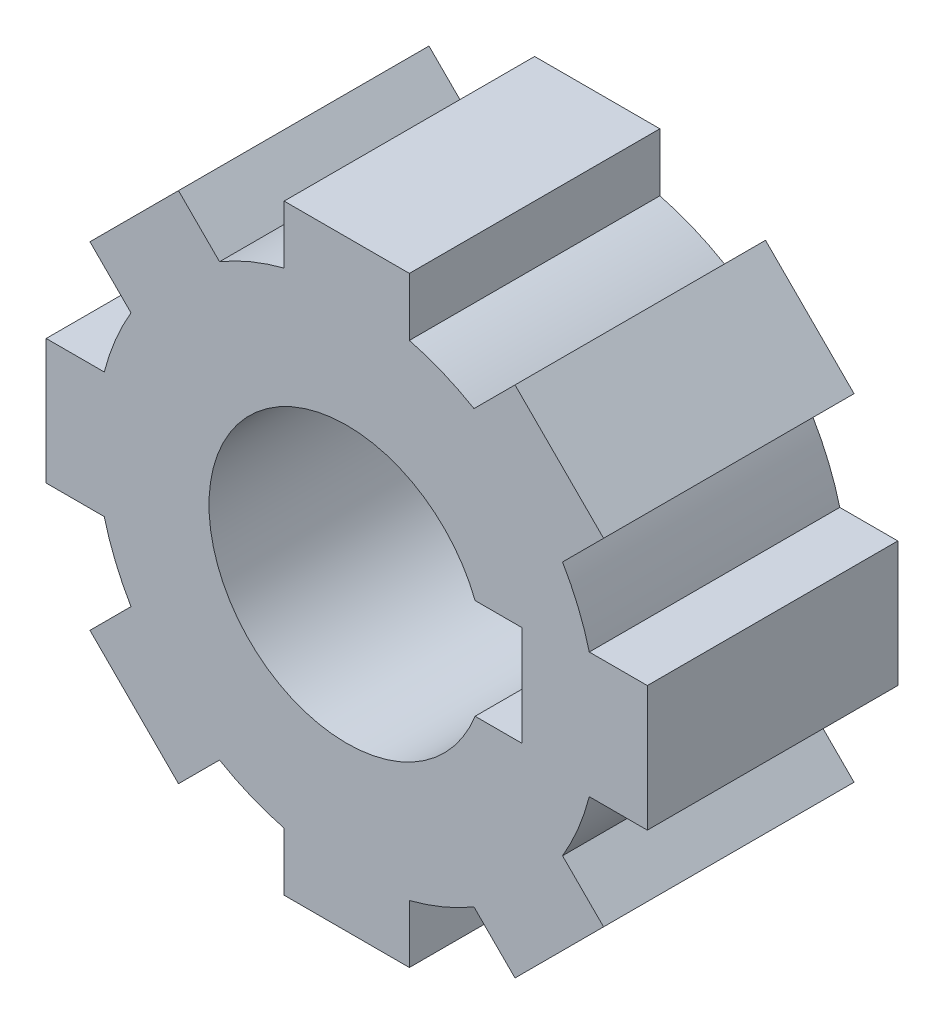
ISO-10303-21;
HEADER;
FILE_DESCRIPTION(('STEP AP214'),'2;1');
FILE_NAME('part.step','',(''),(''),'','','');
FILE_SCHEMA(('AUTOMOTIVE_DESIGN { 1 0 10303 214 1 1 1 1 }'));
ENDSEC;
DATA;
#1=APPLICATION_CONTEXT('core data for automotive mechanical design processes');
#2=APPLICATION_PROTOCOL_DEFINITION('international standard','automotive_design',2000,#1);
#3=PRODUCT_CONTEXT('',#1,'mechanical');
#4=PRODUCT('Part','Part','',(#3));
#5=PRODUCT_RELATED_PRODUCT_CATEGORY('part','',(#4));
#6=PRODUCT_DEFINITION_FORMATION('','',#4);
#7=PRODUCT_DEFINITION_CONTEXT('part definition',#1,'design');
#8=PRODUCT_DEFINITION('design','',#6,#7);
#9=PRODUCT_DEFINITION_SHAPE('','',#8);
#10=(LENGTH_UNIT() NAMED_UNIT(*) SI_UNIT(.MILLI.,.METRE.));
#11=(NAMED_UNIT(*) PLANE_ANGLE_UNIT() SI_UNIT($,.RADIAN.));
#12=(NAMED_UNIT(*) SI_UNIT($,.STERADIAN.) SOLID_ANGLE_UNIT());
#13=UNCERTAINTY_MEASURE_WITH_UNIT(LENGTH_MEASURE(1.E-05),#10,'distance_accuracy_value','');
#14=(GEOMETRIC_REPRESENTATION_CONTEXT(3) GLOBAL_UNCERTAINTY_ASSIGNED_CONTEXT((#13)) GLOBAL_UNIT_ASSIGNED_CONTEXT((#10,
#11,#12)) REPRESENTATION_CONTEXT('',''));
#15=CARTESIAN_POINT('',(0.,0.,0.));
#16=DIRECTION('',(0.,0.,1.));
#17=DIRECTION('',(1.,0.,0.));
#18=AXIS2_PLACEMENT_3D('',#15,#16,#17);
#19=CARTESIAN_POINT('',(0.,0.,5.));
#20=DIRECTION('',(0.,0.,-1.));
#21=DIRECTION('',(-1.,0.,0.));
#22=AXIS2_PLACEMENT_3D('',#19,#20,#21);
#23=CYLINDRICAL_SURFACE('',#22,10.);
#24=CARTESIAN_POINT('',(0.,0.,5.));
#25=DIRECTION('',(0.,0.,1.));
#26=DIRECTION('',(1.,0.,0.));
#27=AXIS2_PLACEMENT_3D('',#24,#25,#26);
#28=CIRCLE('',#27,10.);
#29=CARTESIAN_POINT('',(5.0787650158481,8.61429892178101,5.));
#30=VERTEX_POINT('',#29);
#31=CARTESIAN_POINT('',(2.5,9.68245836551854,5.));
#32=VERTEX_POINT('',#31);
#33=EDGE_CURVE('E603',#30,#32,#28,.T.);
#34=ORIENTED_EDGE('',*,*,#33,.F.);
#35=DIRECTION('',(0.,0.,-1.));
#36=VECTOR('',#35,1.);
#37=CARTESIAN_POINT('',(5.0787650158481,8.61429892178101,5.));
#38=LINE('',#37,#36);
#39=CARTESIAN_POINT('',(5.0787650158481,8.61429892178101,-5.));
#40=VERTEX_POINT('',#39);
#41=EDGE_CURVE('E331',#40,#30,#38,.F.);
#42=ORIENTED_EDGE('',*,*,#41,.F.);
#43=CARTESIAN_POINT('',(0.,0.,-5.));
#44=DIRECTION('',(0.,0.,1.));
#45=DIRECTION('',(1.,0.,0.));
#46=AXIS2_PLACEMENT_3D('',#43,#44,#45);
#47=CIRCLE('',#46,10.);
#48=CARTESIAN_POINT('',(2.5,9.68245836551854,-5.));
#49=VERTEX_POINT('',#48);
#50=EDGE_CURVE('E590',#40,#49,#47,.T.);
#51=ORIENTED_EDGE('',*,*,#50,.T.);
#52=DIRECTION('',(0.,0.,-1.));
#53=VECTOR('',#52,1.);
#54=CARTESIAN_POINT('',(2.5,9.68245836551854,5.));
#55=LINE('',#54,#53);
#56=EDGE_CURVE('E577',#32,#49,#55,.T.);
#57=ORIENTED_EDGE('',*,*,#56,.F.);
#58=EDGE_LOOP('',(#34,#42,#51,#57));
#59=FACE_BOUND('',#58,.T.);
#60=ADVANCED_FACE('F39',(#59),#23,.T.);
#61=CARTESIAN_POINT('',(8.61429892178099,-5.07876501584813,-5.));
#62=VERTEX_POINT('',#61);
#63=CARTESIAN_POINT('',(9.68245836551857,-2.4999999999999,-5.));
#64=VERTEX_POINT('',#63);
#65=EDGE_CURVE('E687',#62,#64,#47,.T.);
#66=ORIENTED_EDGE('',*,*,#65,.T.);
#67=DIRECTION('',(0.,0.,-1.));
#68=VECTOR('',#67,1.);
#69=CARTESIAN_POINT('',(9.68245836551857,-2.4999999999999,5.));
#70=LINE('',#69,#68);
#71=CARTESIAN_POINT('',(9.68245836551857,-2.4999999999999,5.));
#72=VERTEX_POINT('',#71);
#73=EDGE_CURVE('E338',#72,#64,#70,.T.);
#74=ORIENTED_EDGE('',*,*,#73,.F.);
#75=CARTESIAN_POINT('',(8.61429892178099,-5.07876501584813,5.));
#76=VERTEX_POINT('',#75);
#77=EDGE_CURVE('E730',#76,#72,#28,.T.);
#78=ORIENTED_EDGE('',*,*,#77,.F.);
#79=DIRECTION('',(0.,0.,-1.));
#80=VECTOR('',#79,1.);
#81=CARTESIAN_POINT('',(8.61429892178099,-5.07876501584813,5.));
#82=LINE('',#81,#80);
#83=EDGE_CURVE('E403',#62,#76,#82,.F.);
#84=ORIENTED_EDGE('',*,*,#83,.F.);
#85=EDGE_LOOP('',(#66,#74,#78,#84));
#86=FACE_BOUND('',#85,.T.);
#87=ADVANCED_FACE('F634',(#86),#23,.T.);
#88=CARTESIAN_POINT('',(2.5,-9.68245836551853,-5.));
#89=VERTEX_POINT('',#88);
#90=CARTESIAN_POINT('',(5.07876501584828,-8.6142989217809,-5.));
#91=VERTEX_POINT('',#90);
#92=EDGE_CURVE('E691',#89,#91,#47,.T.);
#93=ORIENTED_EDGE('',*,*,#92,.T.);
#94=DIRECTION('',(0.,0.,-1.));
#95=VECTOR('',#94,1.);
#96=CARTESIAN_POINT('',(5.07876501584828,-8.6142989217809,5.));
#97=LINE('',#96,#95);
#98=CARTESIAN_POINT('',(5.07876501584828,-8.6142989217809,5.));
#99=VERTEX_POINT('',#98);
#100=EDGE_CURVE('E349',#99,#91,#97,.T.);
#101=ORIENTED_EDGE('',*,*,#100,.F.);
#102=CARTESIAN_POINT('',(2.5,-9.68245836551853,5.));
#103=VERTEX_POINT('',#102);
#104=EDGE_CURVE('E726',#103,#99,#28,.T.);
#105=ORIENTED_EDGE('',*,*,#104,.F.);
#106=DIRECTION('',(0.,0.,-1.));
#107=VECTOR('',#106,1.);
#108=CARTESIAN_POINT('',(2.5,-9.68245836551854,5.));
#109=LINE('',#108,#107);
#110=EDGE_CURVE('E448',#103,#89,#109,.T.);
#111=ORIENTED_EDGE('',*,*,#110,.T.);
#112=EDGE_LOOP('',(#93,#101,#105,#111));
#113=FACE_BOUND('',#112,.T.);
#114=ADVANCED_FACE('F639',(#113),#23,.T.);
#115=CARTESIAN_POINT('',(9.68245836551852,2.5000000000001,-5.));
#116=VERTEX_POINT('',#115);
#117=CARTESIAN_POINT('',(8.61429892178088,5.07876501584831,-5.));
#118=VERTEX_POINT('',#117);
#119=EDGE_CURVE('E685',#116,#118,#47,.T.);
#120=ORIENTED_EDGE('',*,*,#119,.T.);
#121=DIRECTION('',(0.,0.,-1.));
#122=VECTOR('',#121,1.);
#123=CARTESIAN_POINT('',(8.61429892178088,5.07876501584831,5.));
#124=LINE('',#123,#122);
#125=CARTESIAN_POINT('',(8.61429892178088,5.07876501584831,5.));
#126=VERTEX_POINT('',#125);
#127=EDGE_CURVE('E325',#126,#118,#124,.T.);
#128=ORIENTED_EDGE('',*,*,#127,.F.);
#129=CARTESIAN_POINT('',(9.68245836551852,2.5000000000001,5.));
#130=VERTEX_POINT('',#129);
#131=EDGE_CURVE('E736',#130,#126,#28,.T.);
#132=ORIENTED_EDGE('',*,*,#131,.F.);
#133=DIRECTION('',(0.,0.,-1.));
#134=VECTOR('',#133,1.);
#135=CARTESIAN_POINT('',(9.68245836551852,2.5000000000001,5.));
#136=LINE('',#135,#134);
#137=EDGE_CURVE('E367',#116,#130,#136,.F.);
#138=ORIENTED_EDGE('',*,*,#137,.F.);
#139=EDGE_LOOP('',(#120,#128,#132,#138));
#140=FACE_BOUND('',#139,.T.);
#141=ADVANCED_FACE('F752',(#140),#23,.T.);
#142=CARTESIAN_POINT('',(-9.68245836551853,-2.50000000000003,-5.));
#143=VERTEX_POINT('',#142);
#144=CARTESIAN_POINT('',(-8.61429892178092,-5.07876501584825,-5.));
#145=VERTEX_POINT('',#144);
#146=EDGE_CURVE('E699',#143,#145,#47,.T.);
#147=ORIENTED_EDGE('',*,*,#146,.T.);
#148=DIRECTION('',(0.,0.,-1.));
#149=VECTOR('',#148,1.);
#150=CARTESIAN_POINT('',(-8.61429892178092,-5.07876501584825,5.));
#151=LINE('',#150,#149);
#152=CARTESIAN_POINT('',(-8.61429892178092,-5.07876501584825,5.));
#153=VERTEX_POINT('',#152);
#154=EDGE_CURVE('E452',#153,#145,#151,.T.);
#155=ORIENTED_EDGE('',*,*,#154,.F.);
#156=CARTESIAN_POINT('',(-9.68245836551853,-2.50000000000003,5.));
#157=VERTEX_POINT('',#156);
#158=EDGE_CURVE('E721',#157,#153,#28,.T.);
#159=ORIENTED_EDGE('',*,*,#158,.F.);
#160=DIRECTION('',(0.,0.,-1.));
#161=VECTOR('',#160,1.);
#162=CARTESIAN_POINT('',(-9.68245836551853,-2.50000000000003,5.));
#163=LINE('',#162,#161);
#164=EDGE_CURVE('E511',#143,#157,#163,.F.);
#165=ORIENTED_EDGE('',*,*,#164,.F.);
#166=EDGE_LOOP('',(#147,#155,#159,#165));
#167=FACE_BOUND('',#166,.T.);
#168=ADVANCED_FACE('F800',(#167),#23,.T.);
#169=CARTESIAN_POINT('',(-5.07876501584816,-8.61429892178097,-5.));
#170=VERTEX_POINT('',#169);
#171=CARTESIAN_POINT('',(-2.5,-9.68245836551853,-5.));
#172=VERTEX_POINT('',#171);
#173=EDGE_CURVE('E694',#170,#172,#47,.T.);
#174=ORIENTED_EDGE('',*,*,#173,.T.);
#175=DIRECTION('',(0.,0.,-1.));
#176=VECTOR('',#175,1.);
#177=CARTESIAN_POINT('',(-2.5,-9.68245836551854,5.));
#178=LINE('',#177,#176);
#179=CARTESIAN_POINT('',(-2.5,-9.68245836551854,5.));
#180=VERTEX_POINT('',#179);
#181=EDGE_CURVE('E436',#172,#180,#178,.F.);
#182=ORIENTED_EDGE('',*,*,#181,.T.);
#183=CARTESIAN_POINT('',(-5.07876501584816,-8.61429892178097,5.));
#184=VERTEX_POINT('',#183);
#185=EDGE_CURVE('E723',#184,#180,#28,.T.);
#186=ORIENTED_EDGE('',*,*,#185,.F.);
#187=DIRECTION('',(0.,0.,-1.));
#188=VECTOR('',#187,1.);
#189=CARTESIAN_POINT('',(-5.07876501584816,-8.61429892178097,5.));
#190=LINE('',#189,#188);
#191=EDGE_CURVE('E475',#170,#184,#190,.F.);
#192=ORIENTED_EDGE('',*,*,#191,.F.);
#193=EDGE_LOOP('',(#174,#182,#186,#192));
#194=FACE_BOUND('',#193,.T.);
#195=ADVANCED_FACE('F649',(#194),#23,.T.);
#196=CARTESIAN_POINT('',(-8.61429892178095,5.07876501584819,-5.));
#197=VERTEX_POINT('',#196);
#198=CARTESIAN_POINT('',(-9.68245836551855,2.49999999999997,-5.));
#199=VERTEX_POINT('',#198);
#200=EDGE_CURVE('E607',#197,#199,#47,.T.);
#201=ORIENTED_EDGE('',*,*,#200,.T.);
#202=DIRECTION('',(0.,0.,-1.));
#203=VECTOR('',#202,1.);
#204=CARTESIAN_POINT('',(-9.68245836551855,2.49999999999997,5.));
#205=LINE('',#204,#203);
#206=CARTESIAN_POINT('',(-9.68245836551855,2.49999999999997,5.));
#207=VERTEX_POINT('',#206);
#208=EDGE_CURVE('E505',#207,#199,#205,.T.);
#209=ORIENTED_EDGE('',*,*,#208,.F.);
#210=CARTESIAN_POINT('',(-8.61429892178096,5.07876501584819,5.));
#211=VERTEX_POINT('',#210);
#212=EDGE_CURVE('E602',#211,#207,#28,.T.);
#213=ORIENTED_EDGE('',*,*,#212,.F.);
#214=DIRECTION('',(0.,0.,-1.));
#215=VECTOR('',#214,1.);
#216=CARTESIAN_POINT('',(-8.61429892178095,5.07876501584819,5.));
#217=LINE('',#216,#215);
#218=EDGE_CURVE('E547',#197,#211,#217,.F.);
#219=ORIENTED_EDGE('',*,*,#218,.F.);
#220=EDGE_LOOP('',(#201,#209,#213,#219));
#221=FACE_BOUND('',#220,.T.);
#222=ADVANCED_FACE('F642',(#221),#23,.T.);
#223=CARTESIAN_POINT('',(-2.5,9.68245836551854,-5.));
#224=VERTEX_POINT('',#223);
#225=CARTESIAN_POINT('',(-5.07876501584822,8.61429892178094,-5.));
#226=VERTEX_POINT('',#225);
#227=EDGE_CURVE('E604',#224,#226,#47,.T.);
#228=ORIENTED_EDGE('',*,*,#227,.T.);
#229=DIRECTION('',(0.,0.,-1.));
#230=VECTOR('',#229,1.);
#231=CARTESIAN_POINT('',(-5.07876501584822,8.61429892178093,5.));
#232=LINE('',#231,#230);
#233=CARTESIAN_POINT('',(-5.07876501584822,8.61429892178094,5.));
#234=VERTEX_POINT('',#233);
#235=EDGE_CURVE('E541',#234,#226,#232,.T.);
#236=ORIENTED_EDGE('',*,*,#235,.F.);
#237=CARTESIAN_POINT('',(-2.5,9.68245836551854,5.));
#238=VERTEX_POINT('',#237);
#239=EDGE_CURVE('E597',#238,#234,#28,.T.);
#240=ORIENTED_EDGE('',*,*,#239,.F.);
#241=DIRECTION('',(0.,0.,-1.));
#242=VECTOR('',#241,1.);
#243=CARTESIAN_POINT('',(-2.5,9.68245836551854,5.));
#244=LINE('',#243,#242);
#245=EDGE_CURVE('E583',#224,#238,#244,.F.);
#246=ORIENTED_EDGE('',*,*,#245,.F.);
#247=EDGE_LOOP('',(#228,#236,#240,#246));
#248=FACE_BOUND('',#247,.T.);
#249=ADVANCED_FACE('F41',(#248),#23,.T.);
#250=CARTESIAN_POINT('',(0.,0.,5.));
#251=DIRECTION('',(0.,0.,1.));
#252=DIRECTION('',(1.,0.,0.));
#253=AXIS2_PLACEMENT_3D('',#250,#251,#252);
#254=PLANE('',#253);
#255=CARTESIAN_POINT('',(0.,0.,5.));
#256=DIRECTION('',(0.,0.,1.));
#257=DIRECTION('',(1.,0.,0.));
#258=AXIS2_PLACEMENT_3D('',#255,#256,#257);
#259=CIRCLE('',#258,5.5);
#260=CARTESIAN_POINT('',(5.1234753829798,2.,5.));
#261=VERTEX_POINT('',#260);
#262=CARTESIAN_POINT('',(5.1234753829798,-2.,5.));
#263=VERTEX_POINT('',#262);
#264=EDGE_CURVE('E55',#261,#263,#259,.T.);
#265=ORIENTED_EDGE('',*,*,#264,.F.);
#266=DIRECTION('',(-1.,0.,0.));
#267=VECTOR('',#266,1.);
#268=CARTESIAN_POINT('',(5.1234753829798,2.,5.));
#269=LINE('',#268,#267);
#270=CARTESIAN_POINT('',(7.,2.,5.));
#271=VERTEX_POINT('',#270);
#272=EDGE_CURVE('E294',#271,#261,#269,.T.);
#273=ORIENTED_EDGE('',*,*,#272,.F.);
#274=DIRECTION('',(0.,1.,0.));
#275=VECTOR('',#274,1.);
#276=CARTESIAN_POINT('',(7.,2.,5.));
#277=LINE('',#276,#275);
#278=CARTESIAN_POINT('',(7.,-2.,5.));
#279=VERTEX_POINT('',#278);
#280=EDGE_CURVE('E276',#279,#271,#277,.T.);
#281=ORIENTED_EDGE('',*,*,#280,.F.);
#282=DIRECTION('',(1.,0.,0.));
#283=VECTOR('',#282,1.);
#284=CARTESIAN_POINT('',(5.1234753829798,-2.,5.));
#285=LINE('',#284,#283);
#286=EDGE_CURVE('E286',#263,#279,#285,.T.);
#287=ORIENTED_EDGE('',*,*,#286,.F.);
#288=EDGE_LOOP('',(#265,#273,#281,#287));
#289=FACE_BOUND('',#288,.T.);
#290=ORIENTED_EDGE('',*,*,#185,.T.);
#291=DIRECTION('',(0.,-1.,0.));
#292=VECTOR('',#291,1.);
#293=CARTESIAN_POINT('',(-2.5,12.001,5.));
#294=LINE('',#293,#292);
#295=CARTESIAN_POINT('',(-2.5,-12.,5.));
#296=VERTEX_POINT('',#295);
#297=EDGE_CURVE('E433',#180,#296,#294,.T.);
#298=ORIENTED_EDGE('',*,*,#297,.T.);
#299=DIRECTION('',(-1.,0.,0.));
#300=VECTOR('',#299,1.);
#301=CARTESIAN_POINT('',(2.5,-12.,5.));
#302=LINE('',#301,#300);
#303=CARTESIAN_POINT('',(2.5,-12.,5.));
#304=VERTEX_POINT('',#303);
#305=EDGE_CURVE('E428',#304,#296,#302,.T.);
#306=ORIENTED_EDGE('',*,*,#305,.F.);
#307=DIRECTION('',(0.,-1.,0.));
#308=VECTOR('',#307,1.);
#309=CARTESIAN_POINT('',(2.5,12.001,5.));
#310=LINE('',#309,#308);
#311=EDGE_CURVE('E437',#103,#304,#310,.T.);
#312=ORIENTED_EDGE('',*,*,#311,.F.);
#313=ORIENTED_EDGE('',*,*,#104,.T.);
#314=DIRECTION('',(0.707106781186554,-0.707106781186541,0.));
#315=VECTOR('',#314,1.);
#316=CARTESIAN_POINT('',(-12.7687669529664,9.23323304703351,5.));
#317=LINE('',#316,#315);
#318=CARTESIAN_POINT('',(6.71751442127229,-10.2530483272049,5.));
#319=VERTEX_POINT('',#318);
#320=EDGE_CURVE('E408',#99,#319,#317,.T.);
#321=ORIENTED_EDGE('',*,*,#320,.T.);
#322=DIRECTION('',(-0.707106781186541,-0.707106781186554,0.));
#323=VECTOR('',#322,1.);
#324=CARTESIAN_POINT('',(10.253048327205,-6.71751442127211,5.));
#325=LINE('',#324,#323);
#326=CARTESIAN_POINT('',(10.253048327205,-6.71751442127211,5.));
#327=VERTEX_POINT('',#326);
#328=EDGE_CURVE('E381',#327,#319,#325,.T.);
#329=ORIENTED_EDGE('',*,*,#328,.F.);
#330=DIRECTION('',(0.707106781186554,-0.707106781186541,0.));
#331=VECTOR('',#330,1.);
#332=CARTESIAN_POINT('',(-9.23323304703373,12.7687669529663,5.));
#333=LINE('',#332,#331);
#334=EDGE_CURVE('E407',#76,#327,#333,.T.);
#335=ORIENTED_EDGE('',*,*,#334,.F.);
#336=ORIENTED_EDGE('',*,*,#77,.T.);
#337=DIRECTION('',(1.,0.,0.));
#338=VECTOR('',#337,1.);
#339=CARTESIAN_POINT('',(-10.0010000000001,-2.5000000000001,5.));
#340=LINE('',#339,#338);
#341=CARTESIAN_POINT('',(12.,-2.49999999999987,5.));
#342=VERTEX_POINT('',#341);
#343=EDGE_CURVE('E372',#72,#342,#340,.T.);
#344=ORIENTED_EDGE('',*,*,#343,.T.);
#345=DIRECTION('',(0.,-1.,0.));
#346=VECTOR('',#345,1.);
#347=CARTESIAN_POINT('',(12.,2.50000000000013,5.));
#348=LINE('',#347,#346);
#349=CARTESIAN_POINT('',(12.,2.50000000000013,5.));
#350=VERTEX_POINT('',#349);
#351=EDGE_CURVE('E345',#350,#342,#348,.T.);
#352=ORIENTED_EDGE('',*,*,#351,.F.);
#353=DIRECTION('',(1.,0.,0.));
#354=VECTOR('',#353,1.);
#355=CARTESIAN_POINT('',(-10.0010000000001,2.4999999999999,5.));
#356=LINE('',#355,#354);
#357=EDGE_CURVE('E371',#130,#350,#356,.T.);
#358=ORIENTED_EDGE('',*,*,#357,.F.);
#359=ORIENTED_EDGE('',*,*,#131,.T.);
#360=DIRECTION('',(0.707106781186539,0.707106781186556,0.));
#361=VECTOR('',#360,1.);
#362=CARTESIAN_POINT('',(-8.23323304703348,-11.7687669529665,5.));
#363=LINE('',#362,#361);
#364=CARTESIAN_POINT('',(10.2530483272049,6.71751442127233,5.));
#365=VERTEX_POINT('',#364);
#366=EDGE_CURVE('E330',#126,#365,#363,.T.);
#367=ORIENTED_EDGE('',*,*,#366,.T.);
#368=DIRECTION('',(0.707106781186556,-0.707106781186539,0.));
#369=VECTOR('',#368,1.);
#370=CARTESIAN_POINT('',(6.71751442127208,10.253048327205,5.));
#371=LINE('',#370,#369);
#372=CARTESIAN_POINT('',(6.71751442127208,10.253048327205,5.));
#373=VERTEX_POINT('',#372);
#374=EDGE_CURVE('E309',#373,#365,#371,.T.);
#375=ORIENTED_EDGE('',*,*,#374,.F.);
#376=DIRECTION('',(0.707106781186539,0.707106781186556,0.));
#377=VECTOR('',#376,1.);
#378=CARTESIAN_POINT('',(-11.7687669529663,-8.23323304703377,5.));
#379=LINE('',#378,#377);
#380=EDGE_CURVE('E335',#30,#373,#379,.T.);
#381=ORIENTED_EDGE('',*,*,#380,.F.);
#382=ORIENTED_EDGE('',*,*,#33,.T.);
#383=DIRECTION('',(0.,1.,0.));
#384=VECTOR('',#383,1.);
#385=CARTESIAN_POINT('',(2.5,-10.001,5.));
#386=LINE('',#385,#384);
#387=CARTESIAN_POINT('',(2.5,12.,5.));
#388=VERTEX_POINT('',#387);
#389=EDGE_CURVE('E582',#32,#388,#386,.T.);
#390=ORIENTED_EDGE('',*,*,#389,.T.);
#391=DIRECTION('',(1.,0.,0.));
#392=VECTOR('',#391,1.);
#393=CARTESIAN_POINT('',(-2.5,12.,5.));
#394=LINE('',#393,#392);
#395=CARTESIAN_POINT('',(-2.5,12.,5.));
#396=VERTEX_POINT('',#395);
#397=EDGE_CURVE('E561',#396,#388,#394,.T.);
#398=ORIENTED_EDGE('',*,*,#397,.F.);
#399=DIRECTION('',(0.,1.,0.));
#400=VECTOR('',#399,1.);
#401=CARTESIAN_POINT('',(-2.5,-10.001,5.));
#402=LINE('',#401,#400);
#403=EDGE_CURVE('E587',#238,#396,#402,.T.);
#404=ORIENTED_EDGE('',*,*,#403,.F.);
#405=ORIENTED_EDGE('',*,*,#239,.T.);
#406=DIRECTION('',(-0.707106781186549,0.707106781186546,0.));
#407=VECTOR('',#406,1.);
#408=CARTESIAN_POINT('',(11.7687669529664,-8.23323304703362,5.));
#409=LINE('',#408,#407);
#410=CARTESIAN_POINT('',(-6.71751442127222,10.2530483272049,5.));
#411=VERTEX_POINT('',#410);
#412=EDGE_CURVE('E546',#234,#411,#409,.T.);
#413=ORIENTED_EDGE('',*,*,#412,.T.);
#414=DIRECTION('',(0.707106781186546,0.707106781186549,0.));
#415=VECTOR('',#414,1.);
#416=CARTESIAN_POINT('',(-10.253048327205,6.71751442127218,5.));
#417=LINE('',#416,#415);
#418=CARTESIAN_POINT('',(-10.253048327205,6.71751442127218,5.));
#419=VERTEX_POINT('',#418);
#420=EDGE_CURVE('E525',#419,#411,#417,.T.);
#421=ORIENTED_EDGE('',*,*,#420,.F.);
#422=DIRECTION('',(-0.707106781186549,0.707106781186546,0.));
#423=VECTOR('',#422,1.);
#424=CARTESIAN_POINT('',(8.23323304703365,-11.7687669529664,5.));
#425=LINE('',#424,#423);
#426=EDGE_CURVE('E551',#211,#419,#425,.T.);
#427=ORIENTED_EDGE('',*,*,#426,.F.);
#428=ORIENTED_EDGE('',*,*,#212,.T.);
#429=DIRECTION('',(-1.,0.,0.));
#430=VECTOR('',#429,1.);
#431=CARTESIAN_POINT('',(10.001,2.50000000000003,5.));
#432=LINE('',#431,#430);
#433=CARTESIAN_POINT('',(-12.,2.49999999999996,5.));
#434=VERTEX_POINT('',#433);
#435=EDGE_CURVE('E510',#207,#434,#432,.T.);
#436=ORIENTED_EDGE('',*,*,#435,.T.);
#437=DIRECTION('',(0.,1.,0.));
#438=VECTOR('',#437,1.);
#439=CARTESIAN_POINT('',(-12.,-2.50000000000004,5.));
#440=LINE('',#439,#438);
#441=CARTESIAN_POINT('',(-12.,-2.50000000000004,5.));
#442=VERTEX_POINT('',#441);
#443=EDGE_CURVE('E489',#442,#434,#440,.T.);
#444=ORIENTED_EDGE('',*,*,#443,.F.);
#445=DIRECTION('',(-1.,0.,0.));
#446=VECTOR('',#445,1.);
#447=CARTESIAN_POINT('',(10.001,-2.49999999999997,5.));
#448=LINE('',#447,#446);
#449=EDGE_CURVE('E515',#157,#442,#448,.T.);
#450=ORIENTED_EDGE('',*,*,#449,.F.);
#451=ORIENTED_EDGE('',*,*,#158,.T.);
#452=DIRECTION('',(-0.707106781186544,-0.707106781186551,0.));
#453=VECTOR('',#452,1.);
#454=CARTESIAN_POINT('',(9.23323304703357,12.7687669529664,5.));
#455=LINE('',#454,#453);
#456=CARTESIAN_POINT('',(-10.2530483272049,-6.71751442127226,5.));
#457=VERTEX_POINT('',#456);
#458=EDGE_CURVE('E480',#153,#457,#455,.T.);
#459=ORIENTED_EDGE('',*,*,#458,.T.);
#460=DIRECTION('',(-0.707106781186551,0.707106781186544,0.));
#461=VECTOR('',#460,1.);
#462=CARTESIAN_POINT('',(-6.71751442127215,-10.253048327205,5.));
#463=LINE('',#462,#461);
#464=CARTESIAN_POINT('',(-6.71751442127215,-10.253048327205,5.));
#465=VERTEX_POINT('',#464);
#466=EDGE_CURVE('E453',#465,#457,#463,.T.);
#467=ORIENTED_EDGE('',*,*,#466,.F.);
#468=DIRECTION('',(-0.707106781186544,-0.707106781186551,0.));
#469=VECTOR('',#468,1.);
#470=CARTESIAN_POINT('',(12.7687669529663,9.23323304703371,5.));
#471=LINE('',#470,#469);
#472=EDGE_CURVE('E479',#184,#465,#471,.T.);
#473=ORIENTED_EDGE('',*,*,#472,.F.);
#474=EDGE_LOOP('',(#290,#298,#306,#312,#313,#321,#329,#335,#336,#344,#352,#358,#359,#367,#375,
#381,#382,#390,#398,#404,#405,#413,#421,#427,#428,#436,#444,#450,#451,#459,#467,#473));
#475=FACE_BOUND('',#474,.T.);
#476=ADVANCED_FACE('F291',(#289,#475),#254,.T.);
#477=CARTESIAN_POINT('',(0.,0.,-5.));
#478=DIRECTION('',(0.,0.,1.));
#479=DIRECTION('',(1.,0.,0.));
#480=AXIS2_PLACEMENT_3D('',#477,#478,#479);
#481=PLANE('',#480);
#482=DIRECTION('',(-1.,0.,0.));
#483=VECTOR('',#482,1.);
#484=CARTESIAN_POINT('',(0.,2.,-5.));
#485=LINE('',#484,#483);
#486=CARTESIAN_POINT('',(7.,2.,-5.));
#487=VERTEX_POINT('',#486);
#488=CARTESIAN_POINT('',(5.1234753829798,2.,-5.));
#489=VERTEX_POINT('',#488);
#490=EDGE_CURVE('E48',#487,#489,#485,.T.);
#491=ORIENTED_EDGE('',*,*,#490,.T.);
#492=CARTESIAN_POINT('',(0.,0.,-5.));
#493=DIRECTION('',(0.,0.,1.));
#494=DIRECTION('',(1.,0.,0.));
#495=AXIS2_PLACEMENT_3D('',#492,#493,#494);
#496=CIRCLE('',#495,5.5);
#497=CARTESIAN_POINT('',(5.1234753829798,-2.,-5.));
#498=VERTEX_POINT('',#497);
#499=EDGE_CURVE('E11',#489,#498,#496,.T.);
#500=ORIENTED_EDGE('',*,*,#499,.T.);
#501=DIRECTION('',(1.,0.,0.));
#502=VECTOR('',#501,1.);
#503=CARTESIAN_POINT('',(0.,-2.,-5.));
#504=LINE('',#503,#502);
#505=CARTESIAN_POINT('',(7.,-2.,-5.));
#506=VERTEX_POINT('',#505);
#507=EDGE_CURVE('E601',#498,#506,#504,.T.);
#508=ORIENTED_EDGE('',*,*,#507,.T.);
#509=DIRECTION('',(0.,1.,0.));
#510=VECTOR('',#509,1.);
#511=CARTESIAN_POINT('',(7.,0.,-5.));
#512=LINE('',#511,#510);
#513=EDGE_CURVE('E279',#506,#487,#512,.T.);
#514=ORIENTED_EDGE('',*,*,#513,.T.);
#515=EDGE_LOOP('',(#491,#500,#508,#514));
#516=FACE_BOUND('',#515,.T.);
#517=ORIENTED_EDGE('',*,*,#227,.F.);
#518=DIRECTION('',(0.,1.,0.));
#519=VECTOR('',#518,1.);
#520=CARTESIAN_POINT('',(-2.5,-10.001,-5.));
#521=LINE('',#520,#519);
#522=CARTESIAN_POINT('',(-2.5,12.,-5.));
#523=VERTEX_POINT('',#522);
#524=EDGE_CURVE('E565',#224,#523,#521,.T.);
#525=ORIENTED_EDGE('',*,*,#524,.T.);
#526=DIRECTION('',(-1.,0.,0.));
#527=VECTOR('',#526,1.);
#528=CARTESIAN_POINT('',(-2.5,12.,-5.));
#529=LINE('',#528,#527);
#530=CARTESIAN_POINT('',(2.5,12.,-5.));
#531=VERTEX_POINT('',#530);
#532=EDGE_CURVE('E570',#531,#523,#529,.T.);
#533=ORIENTED_EDGE('',*,*,#532,.F.);
#534=DIRECTION('',(0.,1.,0.));
#535=VECTOR('',#534,1.);
#536=CARTESIAN_POINT('',(2.5,-10.001,-5.));
#537=LINE('',#536,#535);
#538=EDGE_CURVE('E581',#49,#531,#537,.T.);
#539=ORIENTED_EDGE('',*,*,#538,.F.);
#540=ORIENTED_EDGE('',*,*,#50,.F.);
#541=DIRECTION('',(0.707106781186539,0.707106781186556,0.));
#542=VECTOR('',#541,1.);
#543=CARTESIAN_POINT('',(-11.7687669529663,-8.23323304703377,-5.));
#544=LINE('',#543,#542);
#545=CARTESIAN_POINT('',(6.71751442127208,10.253048327205,-5.));
#546=VERTEX_POINT('',#545);
#547=EDGE_CURVE('E313',#40,#546,#544,.T.);
#548=ORIENTED_EDGE('',*,*,#547,.T.);
#549=DIRECTION('',(-0.707106781186556,0.707106781186539,0.));
#550=VECTOR('',#549,1.);
#551=CARTESIAN_POINT('',(6.71751442127208,10.253048327205,-5.));
#552=LINE('',#551,#550);
#553=CARTESIAN_POINT('',(10.2530483272049,6.71751442127233,-5.));
#554=VERTEX_POINT('',#553);
#555=EDGE_CURVE('E318',#554,#546,#552,.T.);
#556=ORIENTED_EDGE('',*,*,#555,.F.);
#557=DIRECTION('',(0.707106781186539,0.707106781186556,0.));
#558=VECTOR('',#557,1.);
#559=CARTESIAN_POINT('',(-8.23323304703348,-11.7687669529665,-5.));
#560=LINE('',#559,#558);
#561=EDGE_CURVE('E329',#118,#554,#560,.T.);
#562=ORIENTED_EDGE('',*,*,#561,.F.);
#563=ORIENTED_EDGE('',*,*,#119,.F.);
#564=DIRECTION('',(1.,0.,0.));
#565=VECTOR('',#564,1.);
#566=CARTESIAN_POINT('',(-10.0010000000001,2.4999999999999,-5.));
#567=LINE('',#566,#565);
#568=CARTESIAN_POINT('',(12.,2.50000000000013,-5.));
#569=VERTEX_POINT('',#568);
#570=EDGE_CURVE('E362',#116,#569,#567,.T.);
#571=ORIENTED_EDGE('',*,*,#570,.T.);
#572=DIRECTION('',(0.,1.,0.));
#573=VECTOR('',#572,1.);
#574=CARTESIAN_POINT('',(12.,2.50000000000013,-5.));
#575=LINE('',#574,#573);
#576=CARTESIAN_POINT('',(12.,-2.49999999999987,-5.));
#577=VERTEX_POINT('',#576);
#578=EDGE_CURVE('E354',#577,#569,#575,.T.);
#579=ORIENTED_EDGE('',*,*,#578,.F.);
#580=DIRECTION('',(1.,0.,0.));
#581=VECTOR('',#580,1.);
#582=CARTESIAN_POINT('',(-10.0010000000001,-2.5000000000001,-5.));
#583=LINE('',#582,#581);
#584=EDGE_CURVE('E366',#64,#577,#583,.T.);
#585=ORIENTED_EDGE('',*,*,#584,.F.);
#586=ORIENTED_EDGE('',*,*,#65,.F.);
#587=DIRECTION('',(0.707106781186554,-0.707106781186541,0.));
#588=VECTOR('',#587,1.);
#589=CARTESIAN_POINT('',(-9.23323304703373,12.7687669529663,-5.));
#590=LINE('',#589,#588);
#591=CARTESIAN_POINT('',(10.253048327205,-6.71751442127211,-5.));
#592=VERTEX_POINT('',#591);
#593=EDGE_CURVE('E398',#62,#592,#590,.T.);
#594=ORIENTED_EDGE('',*,*,#593,.T.);
#595=DIRECTION('',(0.707106781186541,0.707106781186554,0.));
#596=VECTOR('',#595,1.);
#597=CARTESIAN_POINT('',(10.253048327205,-6.71751442127211,-5.));
#598=LINE('',#597,#596);
#599=CARTESIAN_POINT('',(6.71751442127229,-10.2530483272049,-5.));
#600=VERTEX_POINT('',#599);
#601=EDGE_CURVE('E390',#600,#592,#598,.T.);
#602=ORIENTED_EDGE('',*,*,#601,.F.);
#603=DIRECTION('',(0.707106781186554,-0.707106781186541,0.));
#604=VECTOR('',#603,1.);
#605=CARTESIAN_POINT('',(-12.7687669529664,9.23323304703351,-5.));
#606=LINE('',#605,#604);
#607=EDGE_CURVE('E402',#91,#600,#606,.T.);
#608=ORIENTED_EDGE('',*,*,#607,.F.);
#609=ORIENTED_EDGE('',*,*,#92,.F.);
#610=DIRECTION('',(0.,-1.,0.));
#611=VECTOR('',#610,1.);
#612=CARTESIAN_POINT('',(2.5,12.001,-5.));
#613=LINE('',#612,#611);
#614=CARTESIAN_POINT('',(2.5,-12.,-5.));
#615=VERTEX_POINT('',#614);
#616=EDGE_CURVE('E440',#89,#615,#613,.T.);
#617=ORIENTED_EDGE('',*,*,#616,.T.);
#618=DIRECTION('',(1.,0.,0.));
#619=VECTOR('',#618,1.);
#620=CARTESIAN_POINT('',(2.5,-12.,-5.));
#621=LINE('',#620,#619);
#622=CARTESIAN_POINT('',(-2.5,-12.,-5.));
#623=VERTEX_POINT('',#622);
#624=EDGE_CURVE('E420',#623,#615,#621,.T.);
#625=ORIENTED_EDGE('',*,*,#624,.F.);
#626=DIRECTION('',(0.,-1.,0.));
#627=VECTOR('',#626,1.);
#628=CARTESIAN_POINT('',(-2.5,12.001,-5.));
#629=LINE('',#628,#627);
#630=EDGE_CURVE('E432',#172,#623,#629,.T.);
#631=ORIENTED_EDGE('',*,*,#630,.F.);
#632=ORIENTED_EDGE('',*,*,#173,.F.);
#633=DIRECTION('',(-0.707106781186544,-0.707106781186551,0.));
#634=VECTOR('',#633,1.);
#635=CARTESIAN_POINT('',(12.7687669529663,9.23323304703371,-5.));
#636=LINE('',#635,#634);
#637=CARTESIAN_POINT('',(-6.71751442127215,-10.253048327205,-5.));
#638=VERTEX_POINT('',#637);
#639=EDGE_CURVE('E470',#170,#638,#636,.T.);
#640=ORIENTED_EDGE('',*,*,#639,.T.);
#641=DIRECTION('',(0.707106781186551,-0.707106781186544,0.));
#642=VECTOR('',#641,1.);
#643=CARTESIAN_POINT('',(-6.71751442127215,-10.253048327205,-5.));
#644=LINE('',#643,#642);
#645=CARTESIAN_POINT('',(-10.2530483272049,-6.71751442127226,-5.));
#646=VERTEX_POINT('',#645);
#647=EDGE_CURVE('E462',#646,#638,#644,.T.);
#648=ORIENTED_EDGE('',*,*,#647,.F.);
#649=DIRECTION('',(-0.707106781186544,-0.707106781186551,0.));
#650=VECTOR('',#649,1.);
#651=CARTESIAN_POINT('',(9.23323304703357,12.7687669529664,-5.));
#652=LINE('',#651,#650);
#653=EDGE_CURVE('E474',#145,#646,#652,.T.);
#654=ORIENTED_EDGE('',*,*,#653,.F.);
#655=ORIENTED_EDGE('',*,*,#146,.F.);
#656=DIRECTION('',(-1.,0.,0.));
#657=VECTOR('',#656,1.);
#658=CARTESIAN_POINT('',(10.001,-2.49999999999997,-5.));
#659=LINE('',#658,#657);
#660=CARTESIAN_POINT('',(-12.,-2.50000000000004,-5.));
#661=VERTEX_POINT('',#660);
#662=EDGE_CURVE('E493',#143,#661,#659,.T.);
#663=ORIENTED_EDGE('',*,*,#662,.T.);
#664=DIRECTION('',(0.,-1.,0.));
#665=VECTOR('',#664,1.);
#666=CARTESIAN_POINT('',(-12.,-2.50000000000004,-5.));
#667=LINE('',#666,#665);
#668=CARTESIAN_POINT('',(-12.,2.49999999999996,-5.));
#669=VERTEX_POINT('',#668);
#670=EDGE_CURVE('E498',#669,#661,#667,.T.);
#671=ORIENTED_EDGE('',*,*,#670,.F.);
#672=DIRECTION('',(-1.,0.,0.));
#673=VECTOR('',#672,1.);
#674=CARTESIAN_POINT('',(10.001,2.50000000000003,-5.));
#675=LINE('',#674,#673);
#676=EDGE_CURVE('E509',#199,#669,#675,.T.);
#677=ORIENTED_EDGE('',*,*,#676,.F.);
#678=ORIENTED_EDGE('',*,*,#200,.F.);
#679=DIRECTION('',(-0.707106781186549,0.707106781186546,0.));
#680=VECTOR('',#679,1.);
#681=CARTESIAN_POINT('',(8.23323304703365,-11.7687669529664,-5.));
#682=LINE('',#681,#680);
#683=CARTESIAN_POINT('',(-10.253048327205,6.71751442127218,-5.));
#684=VERTEX_POINT('',#683);
#685=EDGE_CURVE('E529',#197,#684,#682,.T.);
#686=ORIENTED_EDGE('',*,*,#685,.T.);
#687=DIRECTION('',(-0.707106781186546,-0.707106781186549,0.));
#688=VECTOR('',#687,1.);
#689=CARTESIAN_POINT('',(-10.253048327205,6.71751442127218,-5.));
#690=LINE('',#689,#688);
#691=CARTESIAN_POINT('',(-6.71751442127222,10.2530483272049,-5.));
#692=VERTEX_POINT('',#691);
#693=EDGE_CURVE('E534',#692,#684,#690,.T.);
#694=ORIENTED_EDGE('',*,*,#693,.F.);
#695=DIRECTION('',(-0.707106781186549,0.707106781186546,0.));
#696=VECTOR('',#695,1.);
#697=CARTESIAN_POINT('',(11.7687669529664,-8.23323304703362,-5.));
#698=LINE('',#697,#696);
#699=EDGE_CURVE('E545',#226,#692,#698,.T.);
#700=ORIENTED_EDGE('',*,*,#699,.F.);
#701=EDGE_LOOP('',(#517,#525,#533,#539,#540,#548,#556,#562,#563,#571,#579,#585,#586,#594,#602,
#608,#609,#617,#625,#631,#632,#640,#648,#654,#655,#663,#671,#677,#678,#686,#694,#700));
#702=FACE_BOUND('',#701,.T.);
#703=ADVANCED_FACE('F614',(#516,#702),#481,.F.);
#704=CARTESIAN_POINT('',(0.,12.,0.));
#705=DIRECTION('',(0.,1.,0.));
#706=DIRECTION('',(0.,0.,1.));
#707=AXIS2_PLACEMENT_3D('',#704,#705,#706);
#708=PLANE('',#707);
#709=DIRECTION('',(0.,0.,-1.));
#710=VECTOR('',#709,1.);
#711=CARTESIAN_POINT('',(2.5,12.,-5.));
#712=LINE('',#711,#710);
#713=EDGE_CURVE('E554',#388,#531,#712,.T.);
#714=ORIENTED_EDGE('',*,*,#713,.T.);
#715=ORIENTED_EDGE('',*,*,#532,.T.);
#716=DIRECTION('',(0.,0.,1.));
#717=VECTOR('',#716,1.);
#718=CARTESIAN_POINT('',(-2.5,12.,-5.));
#719=LINE('',#718,#717);
#720=EDGE_CURVE('E566',#523,#396,#719,.T.);
#721=ORIENTED_EDGE('',*,*,#720,.T.);
#722=ORIENTED_EDGE('',*,*,#397,.T.);
#723=EDGE_LOOP('',(#714,#715,#721,#722));
#724=FACE_BOUND('',#723,.T.);
#725=ADVANCED_FACE('F676',(#724),#708,.T.);
#726=CARTESIAN_POINT('',(-2.5,-10.001,-5.));
#727=DIRECTION('',(-1.,0.,0.));
#728=DIRECTION('',(0.,0.,1.));
#729=AXIS2_PLACEMENT_3D('',#726,#727,#728);
#730=PLANE('',#729);
#731=ORIENTED_EDGE('',*,*,#524,.F.);
#732=ORIENTED_EDGE('',*,*,#245,.T.);
#733=ORIENTED_EDGE('',*,*,#403,.T.);
#734=ORIENTED_EDGE('',*,*,#720,.F.);
#735=EDGE_LOOP('',(#731,#732,#733,#734));
#736=FACE_BOUND('',#735,.T.);
#737=ADVANCED_FACE('F671',(#736),#730,.T.);
#738=CARTESIAN_POINT('',(2.5,-10.001,-5.));
#739=DIRECTION('',(1.,0.,0.));
#740=DIRECTION('',(0.,0.,-1.));
#741=AXIS2_PLACEMENT_3D('',#738,#739,#740);
#742=PLANE('',#741);
#743=ORIENTED_EDGE('',*,*,#389,.F.);
#744=ORIENTED_EDGE('',*,*,#56,.T.);
#745=ORIENTED_EDGE('',*,*,#538,.T.);
#746=ORIENTED_EDGE('',*,*,#713,.F.);
#747=EDGE_LOOP('',(#743,#744,#745,#746));
#748=FACE_BOUND('',#747,.T.);
#749=ADVANCED_FACE('F679',(#748),#742,.T.);
#750=CARTESIAN_POINT('',(-8.48528137423859,8.48528137423856,0.));
#751=DIRECTION('',(-0.707106781186549,0.707106781186546,0.));
#752=DIRECTION('',(0.,0.,1.));
#753=AXIS2_PLACEMENT_3D('',#750,#751,#752);
#754=PLANE('',#753);
#755=DIRECTION('',(0.,0.,-1.));
#756=VECTOR('',#755,1.);
#757=CARTESIAN_POINT('',(-6.71751442127222,10.2530483272049,-5.));
#758=LINE('',#757,#756);
#759=EDGE_CURVE('E518',#411,#692,#758,.T.);
#760=ORIENTED_EDGE('',*,*,#759,.T.);
#761=ORIENTED_EDGE('',*,*,#693,.T.);
#762=DIRECTION('',(0.,0.,1.));
#763=VECTOR('',#762,1.);
#764=CARTESIAN_POINT('',(-10.253048327205,6.71751442127218,-5.));
#765=LINE('',#764,#763);
#766=EDGE_CURVE('E530',#684,#419,#765,.T.);
#767=ORIENTED_EDGE('',*,*,#766,.T.);
#768=ORIENTED_EDGE('',*,*,#420,.T.);
#769=EDGE_LOOP('',(#760,#761,#767,#768));
#770=FACE_BOUND('',#769,.T.);
#771=ADVANCED_FACE('F662',(#770),#754,.T.);
#772=CARTESIAN_POINT('',(8.23323304703365,-11.7687669529664,-5.));
#773=DIRECTION('',(-0.707106781186546,-0.707106781186549,0.));
#774=DIRECTION('',(0.707106781186549,-0.707106781186546,0.));
#775=AXIS2_PLACEMENT_3D('',#772,#773,#774);
#776=PLANE('',#775);
#777=ORIENTED_EDGE('',*,*,#685,.F.);
#778=ORIENTED_EDGE('',*,*,#218,.T.);
#779=ORIENTED_EDGE('',*,*,#426,.T.);
#780=ORIENTED_EDGE('',*,*,#766,.F.);
#781=EDGE_LOOP('',(#777,#778,#779,#780));
#782=FACE_BOUND('',#781,.T.);
#783=ADVANCED_FACE('F815',(#782),#776,.T.);
#784=CARTESIAN_POINT('',(11.7687669529664,-8.23323304703362,-5.));
#785=DIRECTION('',(0.707106781186546,0.707106781186549,0.));
#786=DIRECTION('',(-0.707106781186549,0.707106781186546,0.));
#787=AXIS2_PLACEMENT_3D('',#784,#785,#786);
#788=PLANE('',#787);
#789=ORIENTED_EDGE('',*,*,#412,.F.);
#790=ORIENTED_EDGE('',*,*,#235,.T.);
#791=ORIENTED_EDGE('',*,*,#699,.T.);
#792=ORIENTED_EDGE('',*,*,#759,.F.);
#793=EDGE_LOOP('',(#789,#790,#791,#792));
#794=FACE_BOUND('',#793,.T.);
#795=ADVANCED_FACE('F656',(#794),#788,.T.);
#796=CARTESIAN_POINT('',(-12.,0.,0.));
#797=DIRECTION('',(-1.,0.,0.));
#798=DIRECTION('',(0.,0.,1.));
#799=AXIS2_PLACEMENT_3D('',#796,#797,#798);
#800=PLANE('',#799);
#801=DIRECTION('',(0.,0.,-1.));
#802=VECTOR('',#801,1.);
#803=CARTESIAN_POINT('',(-12.,2.49999999999996,-5.));
#804=LINE('',#803,#802);
#805=EDGE_CURVE('E457',#434,#669,#804,.T.);
#806=ORIENTED_EDGE('',*,*,#805,.T.);
#807=ORIENTED_EDGE('',*,*,#670,.T.);
#808=DIRECTION('',(0.,0.,1.));
#809=VECTOR('',#808,1.);
#810=CARTESIAN_POINT('',(-12.,-2.50000000000004,-5.));
#811=LINE('',#810,#809);
#812=EDGE_CURVE('E494',#661,#442,#811,.T.);
#813=ORIENTED_EDGE('',*,*,#812,.T.);
#814=ORIENTED_EDGE('',*,*,#443,.T.);
#815=EDGE_LOOP('',(#806,#807,#813,#814));
#816=FACE_BOUND('',#815,.T.);
#817=ADVANCED_FACE('F716',(#816),#800,.T.);
#818=CARTESIAN_POINT('',(10.001,-2.49999999999997,-5.));
#819=DIRECTION('',(0.,-1.,0.));
#820=DIRECTION('',(1.,0.,0.));
#821=AXIS2_PLACEMENT_3D('',#818,#819,#820);
#822=PLANE('',#821);
#823=ORIENTED_EDGE('',*,*,#662,.F.);
#824=ORIENTED_EDGE('',*,*,#164,.T.);
#825=ORIENTED_EDGE('',*,*,#449,.T.);
#826=ORIENTED_EDGE('',*,*,#812,.F.);
#827=EDGE_LOOP('',(#823,#824,#825,#826));
#828=FACE_BOUND('',#827,.T.);
#829=ADVANCED_FACE('F802',(#828),#822,.T.);
#830=CARTESIAN_POINT('',(10.001,2.50000000000003,-5.));
#831=DIRECTION('',(0.,1.,0.));
#832=DIRECTION('',(-1.,0.,0.));
#833=AXIS2_PLACEMENT_3D('',#830,#831,#832);
#834=PLANE('',#833);
#835=ORIENTED_EDGE('',*,*,#435,.F.);
#836=ORIENTED_EDGE('',*,*,#208,.T.);
#837=ORIENTED_EDGE('',*,*,#676,.T.);
#838=ORIENTED_EDGE('',*,*,#805,.F.);
#839=EDGE_LOOP('',(#835,#836,#837,#838));
#840=FACE_BOUND('',#839,.T.);
#841=ADVANCED_FACE('F710',(#840),#834,.T.);
#842=CARTESIAN_POINT('',(9.23323304703357,12.7687669529664,-5.));
#843=DIRECTION('',(-0.707106781186551,0.707106781186544,0.));
#844=DIRECTION('',(-0.707106781186544,-0.707106781186551,0.));
#845=AXIS2_PLACEMENT_3D('',#842,#843,#844);
#846=PLANE('',#845);
#847=ORIENTED_EDGE('',*,*,#458,.F.);
#848=ORIENTED_EDGE('',*,*,#154,.T.);
#849=ORIENTED_EDGE('',*,*,#653,.T.);
#850=DIRECTION('',(0.,0.,-1.));
#851=VECTOR('',#850,1.);
#852=CARTESIAN_POINT('',(-10.2530483272049,-6.71751442127226,-5.));
#853=LINE('',#852,#851);
#854=EDGE_CURVE('E466',#457,#646,#853,.T.);
#855=ORIENTED_EDGE('',*,*,#854,.F.);
#856=EDGE_LOOP('',(#847,#848,#849,#855));
#857=FACE_BOUND('',#856,.T.);
#858=ADVANCED_FACE('F799',(#857),#846,.T.);
#859=CARTESIAN_POINT('',(12.7687669529663,9.23323304703371,-5.));
#860=DIRECTION('',(0.707106781186551,-0.707106781186544,0.));
#861=DIRECTION('',(0.707106781186544,0.707106781186551,0.));
#862=AXIS2_PLACEMENT_3D('',#859,#860,#861);
#863=PLANE('',#862);
#864=ORIENTED_EDGE('',*,*,#639,.F.);
#865=ORIENTED_EDGE('',*,*,#191,.T.);
#866=ORIENTED_EDGE('',*,*,#472,.T.);
#867=DIRECTION('',(0.,0.,1.));
#868=VECTOR('',#867,1.);
#869=CARTESIAN_POINT('',(-6.71751442127215,-10.253048327205,-5.));
#870=LINE('',#869,#868);
#871=EDGE_CURVE('E458',#638,#465,#870,.T.);
#872=ORIENTED_EDGE('',*,*,#871,.F.);
#873=EDGE_LOOP('',(#864,#865,#866,#872));
#874=FACE_BOUND('',#873,.T.);
#875=ADVANCED_FACE('F792',(#874),#863,.T.);
#876=CARTESIAN_POINT('',(-8.48528137423853,-8.48528137423861,0.));
#877=DIRECTION('',(-0.707106781186544,-0.707106781186551,0.));
#878=DIRECTION('',(0.,0.,1.));
#879=AXIS2_PLACEMENT_3D('',#876,#877,#878);
#880=PLANE('',#879);
#881=ORIENTED_EDGE('',*,*,#854,.T.);
#882=ORIENTED_EDGE('',*,*,#647,.T.);
#883=ORIENTED_EDGE('',*,*,#871,.T.);
#884=ORIENTED_EDGE('',*,*,#466,.T.);
#885=EDGE_LOOP('',(#881,#882,#883,#884));
#886=FACE_BOUND('',#885,.T.);
#887=ADVANCED_FACE('F795',(#886),#880,.T.);
#888=CARTESIAN_POINT('',(2.5,12.001,-5.));
#889=DIRECTION('',(1.,0.,0.));
#890=DIRECTION('',(0.,0.,-1.));
#891=AXIS2_PLACEMENT_3D('',#888,#889,#890);
#892=PLANE('',#891);
#893=ORIENTED_EDGE('',*,*,#110,.F.);
#894=ORIENTED_EDGE('',*,*,#311,.T.);
#895=DIRECTION('',(0.,0.,1.));
#896=VECTOR('',#895,1.);
#897=CARTESIAN_POINT('',(2.5,-12.,-5.));
#898=LINE('',#897,#896);
#899=EDGE_CURVE('E424',#615,#304,#898,.T.);
#900=ORIENTED_EDGE('',*,*,#899,.F.);
#901=ORIENTED_EDGE('',*,*,#616,.F.);
#902=EDGE_LOOP('',(#893,#894,#900,#901));
#903=FACE_BOUND('',#902,.T.);
#904=ADVANCED_FACE('F781',(#903),#892,.T.);
#905=CARTESIAN_POINT('',(-2.5,12.001,-5.));
#906=DIRECTION('',(-1.,0.,0.));
#907=DIRECTION('',(0.,0.,1.));
#908=AXIS2_PLACEMENT_3D('',#905,#906,#907);
#909=PLANE('',#908);
#910=ORIENTED_EDGE('',*,*,#181,.F.);
#911=ORIENTED_EDGE('',*,*,#630,.T.);
#912=DIRECTION('',(0.,0.,-1.));
#913=VECTOR('',#912,1.);
#914=CARTESIAN_POINT('',(-2.5,-12.,-5.));
#915=LINE('',#914,#913);
#916=EDGE_CURVE('E385',#296,#623,#915,.T.);
#917=ORIENTED_EDGE('',*,*,#916,.F.);
#918=ORIENTED_EDGE('',*,*,#297,.F.);
#919=EDGE_LOOP('',(#910,#911,#917,#918));
#920=FACE_BOUND('',#919,.T.);
#921=ADVANCED_FACE('F787',(#920),#909,.T.);
#922=CARTESIAN_POINT('',(0.,-12.,0.));
#923=DIRECTION('',(0.,-1.,0.));
#924=DIRECTION('',(0.,0.,1.));
#925=AXIS2_PLACEMENT_3D('',#922,#923,#924);
#926=PLANE('',#925);
#927=ORIENTED_EDGE('',*,*,#916,.T.);
#928=ORIENTED_EDGE('',*,*,#624,.T.);
#929=ORIENTED_EDGE('',*,*,#899,.T.);
#930=ORIENTED_EDGE('',*,*,#305,.T.);
#931=EDGE_LOOP('',(#927,#928,#929,#930));
#932=FACE_BOUND('',#931,.T.);
#933=ADVANCED_FACE('F784',(#932),#926,.T.);
#934=CARTESIAN_POINT('',(-12.7687669529664,9.23323304703351,-5.));
#935=DIRECTION('',(-0.707106781186541,-0.707106781186554,0.));
#936=DIRECTION('',(0.707106781186554,-0.707106781186541,0.));
#937=AXIS2_PLACEMENT_3D('',#934,#935,#936);
#938=PLANE('',#937);
#939=ORIENTED_EDGE('',*,*,#320,.F.);
#940=ORIENTED_EDGE('',*,*,#100,.T.);
#941=ORIENTED_EDGE('',*,*,#607,.T.);
#942=DIRECTION('',(0.,0.,-1.));
#943=VECTOR('',#942,1.);
#944=CARTESIAN_POINT('',(6.71751442127229,-10.2530483272049,-5.));
#945=LINE('',#944,#943);
#946=EDGE_CURVE('E394',#319,#600,#945,.T.);
#947=ORIENTED_EDGE('',*,*,#946,.F.);
#948=EDGE_LOOP('',(#939,#940,#941,#947));
#949=FACE_BOUND('',#948,.T.);
#950=ADVANCED_FACE('F776',(#949),#938,.T.);
#951=CARTESIAN_POINT('',(-9.23323304703373,12.7687669529663,-5.));
#952=DIRECTION('',(0.707106781186541,0.707106781186554,0.));
#953=DIRECTION('',(-0.707106781186554,0.707106781186541,0.));
#954=AXIS2_PLACEMENT_3D('',#951,#952,#953);
#955=PLANE('',#954);
#956=ORIENTED_EDGE('',*,*,#593,.F.);
#957=ORIENTED_EDGE('',*,*,#83,.T.);
#958=ORIENTED_EDGE('',*,*,#334,.T.);
#959=DIRECTION('',(0.,0.,1.));
#960=VECTOR('',#959,1.);
#961=CARTESIAN_POINT('',(10.253048327205,-6.71751442127211,-5.));
#962=LINE('',#961,#960);
#963=EDGE_CURVE('E386',#592,#327,#962,.T.);
#964=ORIENTED_EDGE('',*,*,#963,.F.);
#965=EDGE_LOOP('',(#956,#957,#958,#964));
#966=FACE_BOUND('',#965,.T.);
#967=ADVANCED_FACE('F769',(#966),#955,.T.);
#968=CARTESIAN_POINT('',(8.48528137423864,-8.4852813742385,0.));
#969=DIRECTION('',(0.707106781186554,-0.707106781186541,0.));
#970=DIRECTION('',(0.,0.,1.));
#971=AXIS2_PLACEMENT_3D('',#968,#969,#970);
#972=PLANE('',#971);
#973=ORIENTED_EDGE('',*,*,#946,.T.);
#974=ORIENTED_EDGE('',*,*,#601,.T.);
#975=ORIENTED_EDGE('',*,*,#963,.T.);
#976=ORIENTED_EDGE('',*,*,#328,.T.);
#977=EDGE_LOOP('',(#973,#974,#975,#976));
#978=FACE_BOUND('',#977,.T.);
#979=ADVANCED_FACE('F774',(#978),#972,.T.);
#980=CARTESIAN_POINT('',(-10.0010000000001,-2.5000000000001,-5.));
#981=DIRECTION('',(0.,-1.,0.));
#982=DIRECTION('',(1.,0.,0.));
#983=AXIS2_PLACEMENT_3D('',#980,#981,#982);
#984=PLANE('',#983);
#985=ORIENTED_EDGE('',*,*,#343,.F.);
#986=ORIENTED_EDGE('',*,*,#73,.T.);
#987=ORIENTED_EDGE('',*,*,#584,.T.);
#988=DIRECTION('',(0.,0.,-1.));
#989=VECTOR('',#988,1.);
#990=CARTESIAN_POINT('',(12.,-2.49999999999987,-5.));
#991=LINE('',#990,#989);
#992=EDGE_CURVE('E358',#342,#577,#991,.T.);
#993=ORIENTED_EDGE('',*,*,#992,.F.);
#994=EDGE_LOOP('',(#985,#986,#987,#993));
#995=FACE_BOUND('',#994,.T.);
#996=ADVANCED_FACE('F764',(#995),#984,.T.);
#997=CARTESIAN_POINT('',(-10.0010000000001,2.4999999999999,-5.));
#998=DIRECTION('',(0.,1.,0.));
#999=DIRECTION('',(-1.,0.,0.));
#1000=AXIS2_PLACEMENT_3D('',#997,#998,#999);
#1001=PLANE('',#1000);
#1002=ORIENTED_EDGE('',*,*,#570,.F.);
#1003=ORIENTED_EDGE('',*,*,#137,.T.);
#1004=ORIENTED_EDGE('',*,*,#357,.T.);
#1005=DIRECTION('',(0.,0.,1.));
#1006=VECTOR('',#1005,1.);
#1007=CARTESIAN_POINT('',(12.,2.50000000000013,-5.));
#1008=LINE('',#1007,#1006);
#1009=EDGE_CURVE('E350',#569,#350,#1008,.T.);
#1010=ORIENTED_EDGE('',*,*,#1009,.F.);
#1011=EDGE_LOOP('',(#1002,#1003,#1004,#1010));
#1012=FACE_BOUND('',#1011,.T.);
#1013=ADVANCED_FACE('F757',(#1012),#1001,.T.);
#1014=CARTESIAN_POINT('',(12.,1.25693328198353E-13,0.));
#1015=DIRECTION('',(1.,0.,0.));
#1016=DIRECTION('',(0.,0.,1.));
#1017=AXIS2_PLACEMENT_3D('',#1014,#1015,#1016);
#1018=PLANE('',#1017);
#1019=ORIENTED_EDGE('',*,*,#992,.T.);
#1020=ORIENTED_EDGE('',*,*,#578,.T.);
#1021=ORIENTED_EDGE('',*,*,#1009,.T.);
#1022=ORIENTED_EDGE('',*,*,#351,.T.);
#1023=EDGE_LOOP('',(#1019,#1020,#1021,#1022));
#1024=FACE_BOUND('',#1023,.T.);
#1025=ADVANCED_FACE('F762',(#1024),#1018,.T.);
#1026=CARTESIAN_POINT('',(8.48528137423847,8.48528137423867,0.));
#1027=DIRECTION('',(0.707106781186539,0.707106781186556,0.));
#1028=DIRECTION('',(0.,0.,1.));
#1029=AXIS2_PLACEMENT_3D('',#1026,#1027,#1028);
#1030=PLANE('',#1029);
#1031=DIRECTION('',(0.,0.,-1.));
#1032=VECTOR('',#1031,1.);
#1033=CARTESIAN_POINT('',(10.2530483272049,6.71751442127233,-5.));
#1034=LINE('',#1033,#1032);
#1035=EDGE_CURVE('E304',#365,#554,#1034,.T.);
#1036=ORIENTED_EDGE('',*,*,#1035,.T.);
#1037=ORIENTED_EDGE('',*,*,#555,.T.);
#1038=DIRECTION('',(0.,0.,1.));
#1039=VECTOR('',#1038,1.);
#1040=CARTESIAN_POINT('',(6.71751442127208,10.253048327205,-5.));
#1041=LINE('',#1040,#1039);
#1042=EDGE_CURVE('E314',#546,#373,#1041,.T.);
#1043=ORIENTED_EDGE('',*,*,#1042,.T.);
#1044=ORIENTED_EDGE('',*,*,#374,.T.);
#1045=EDGE_LOOP('',(#1036,#1037,#1043,#1044));
#1046=FACE_BOUND('',#1045,.T.);
#1047=ADVANCED_FACE('F751',(#1046),#1030,.T.);
#1048=CARTESIAN_POINT('',(-11.7687669529663,-8.23323304703377,-5.));
#1049=DIRECTION('',(-0.707106781186556,0.707106781186539,0.));
#1050=DIRECTION('',(-0.707106781186539,-0.707106781186556,0.));
#1051=AXIS2_PLACEMENT_3D('',#1048,#1049,#1050);
#1052=PLANE('',#1051);
#1053=ORIENTED_EDGE('',*,*,#547,.F.);
#1054=ORIENTED_EDGE('',*,*,#41,.T.);
#1055=ORIENTED_EDGE('',*,*,#380,.T.);
#1056=ORIENTED_EDGE('',*,*,#1042,.F.);
#1057=EDGE_LOOP('',(#1053,#1054,#1055,#1056));
#1058=FACE_BOUND('',#1057,.T.);
#1059=ADVANCED_FACE('F628',(#1058),#1052,.T.);
#1060=CARTESIAN_POINT('',(-8.23323304703348,-11.7687669529665,-5.));
#1061=DIRECTION('',(0.707106781186556,-0.707106781186539,0.));
#1062=DIRECTION('',(0.707106781186539,0.707106781186556,0.));
#1063=AXIS2_PLACEMENT_3D('',#1060,#1061,#1062);
#1064=PLANE('',#1063);
#1065=ORIENTED_EDGE('',*,*,#366,.F.);
#1066=ORIENTED_EDGE('',*,*,#127,.T.);
#1067=ORIENTED_EDGE('',*,*,#561,.T.);
#1068=ORIENTED_EDGE('',*,*,#1035,.F.);
#1069=EDGE_LOOP('',(#1065,#1066,#1067,#1068));
#1070=FACE_BOUND('',#1069,.T.);
#1071=ADVANCED_FACE('F621',(#1070),#1064,.T.);
#1072=CARTESIAN_POINT('',(0.,0.,-25.));
#1073=DIRECTION('',(0.,0.,1.));
#1074=DIRECTION('',(1.,0.,0.));
#1075=AXIS2_PLACEMENT_3D('',#1072,#1073,#1074);
#1076=CYLINDRICAL_SURFACE('',#1075,5.5);
#1077=DIRECTION('',(0.,0.,1.));
#1078=VECTOR('',#1077,1.);
#1079=CARTESIAN_POINT('',(5.1234753829798,2.,-25.));
#1080=LINE('',#1079,#1078);
#1081=EDGE_CURVE('E301',#489,#261,#1080,.T.);
#1082=ORIENTED_EDGE('',*,*,#1081,.T.);
#1083=ORIENTED_EDGE('',*,*,#264,.T.);
#1084=DIRECTION('',(0.,0.,1.));
#1085=VECTOR('',#1084,1.);
#1086=CARTESIAN_POINT('',(5.1234753829798,-2.,-25.));
#1087=LINE('',#1086,#1085);
#1088=EDGE_CURVE('E283',#498,#263,#1087,.T.);
#1089=ORIENTED_EDGE('',*,*,#1088,.F.);
#1090=ORIENTED_EDGE('',*,*,#499,.F.);
#1091=EDGE_LOOP('',(#1082,#1083,#1089,#1090));
#1092=FACE_BOUND('',#1091,.T.);
#1093=ADVANCED_FACE('F619',(#1092),#1076,.F.);
#1094=CARTESIAN_POINT('',(5.1234753829798,2.,-25.));
#1095=DIRECTION('',(0.,1.,0.));
#1096=DIRECTION('',(0.,0.,1.));
#1097=AXIS2_PLACEMENT_3D('',#1094,#1095,#1096);
#1098=PLANE('',#1097);
#1099=DIRECTION('',(0.,0.,1.));
#1100=VECTOR('',#1099,1.);
#1101=CARTESIAN_POINT('',(7.,2.,-25.));
#1102=LINE('',#1101,#1100);
#1103=EDGE_CURVE('E282',#487,#271,#1102,.T.);
#1104=ORIENTED_EDGE('',*,*,#1103,.T.);
#1105=ORIENTED_EDGE('',*,*,#272,.T.);
#1106=ORIENTED_EDGE('',*,*,#1081,.F.);
#1107=ORIENTED_EDGE('',*,*,#490,.F.);
#1108=EDGE_LOOP('',(#1104,#1105,#1106,#1107));
#1109=FACE_BOUND('',#1108,.T.);
#1110=ADVANCED_FACE('F618',(#1109),#1098,.F.);
#1111=CARTESIAN_POINT('',(7.,2.,-25.));
#1112=DIRECTION('',(1.,0.,0.));
#1113=DIRECTION('',(0.,0.,-1.));
#1114=AXIS2_PLACEMENT_3D('',#1111,#1112,#1113);
#1115=PLANE('',#1114);
#1116=DIRECTION('',(0.,0.,1.));
#1117=VECTOR('',#1116,1.);
#1118=CARTESIAN_POINT('',(7.,-2.,-25.));
#1119=LINE('',#1118,#1117);
#1120=EDGE_CURVE('E63',#506,#279,#1119,.T.);
#1121=ORIENTED_EDGE('',*,*,#1120,.T.);
#1122=ORIENTED_EDGE('',*,*,#280,.T.);
#1123=ORIENTED_EDGE('',*,*,#1103,.F.);
#1124=ORIENTED_EDGE('',*,*,#513,.F.);
#1125=EDGE_LOOP('',(#1121,#1122,#1123,#1124));
#1126=FACE_BOUND('',#1125,.T.);
#1127=ADVANCED_FACE('F273',(#1126),#1115,.F.);
#1128=CARTESIAN_POINT('',(5.1234753829798,-2.,-25.));
#1129=DIRECTION('',(0.,-1.,0.));
#1130=DIRECTION('',(0.,0.,-1.));
#1131=AXIS2_PLACEMENT_3D('',#1128,#1129,#1130);
#1132=PLANE('',#1131);
#1133=ORIENTED_EDGE('',*,*,#1088,.T.);
#1134=ORIENTED_EDGE('',*,*,#286,.T.);
#1135=ORIENTED_EDGE('',*,*,#1120,.F.);
#1136=ORIENTED_EDGE('',*,*,#507,.F.);
#1137=EDGE_LOOP('',(#1133,#1134,#1135,#1136));
#1138=FACE_BOUND('',#1137,.T.);
#1139=ADVANCED_FACE('F287',(#1138),#1132,.F.);
#1140=CLOSED_SHELL('',(#60,#87,#114,#141,#168,#195,#222,#249,#476,#703,#725,#737,#749,#771,#783,
#795,#817,#829,#841,#858,#875,#887,#904,#921,#933,#950,#967,#979,#996,#1013,#1025,#1047,#1059,
#1071,#1093,#1110,#1127,#1139));
#1141=MANIFOLD_SOLID_BREP('B2',#1140);
#1142=ADVANCED_BREP_SHAPE_REPRESENTATION('',(#18,#1141),#14);
#1143=SHAPE_DEFINITION_REPRESENTATION(#9,#1142);
ENDSEC;
END-ISO-10303-21;
